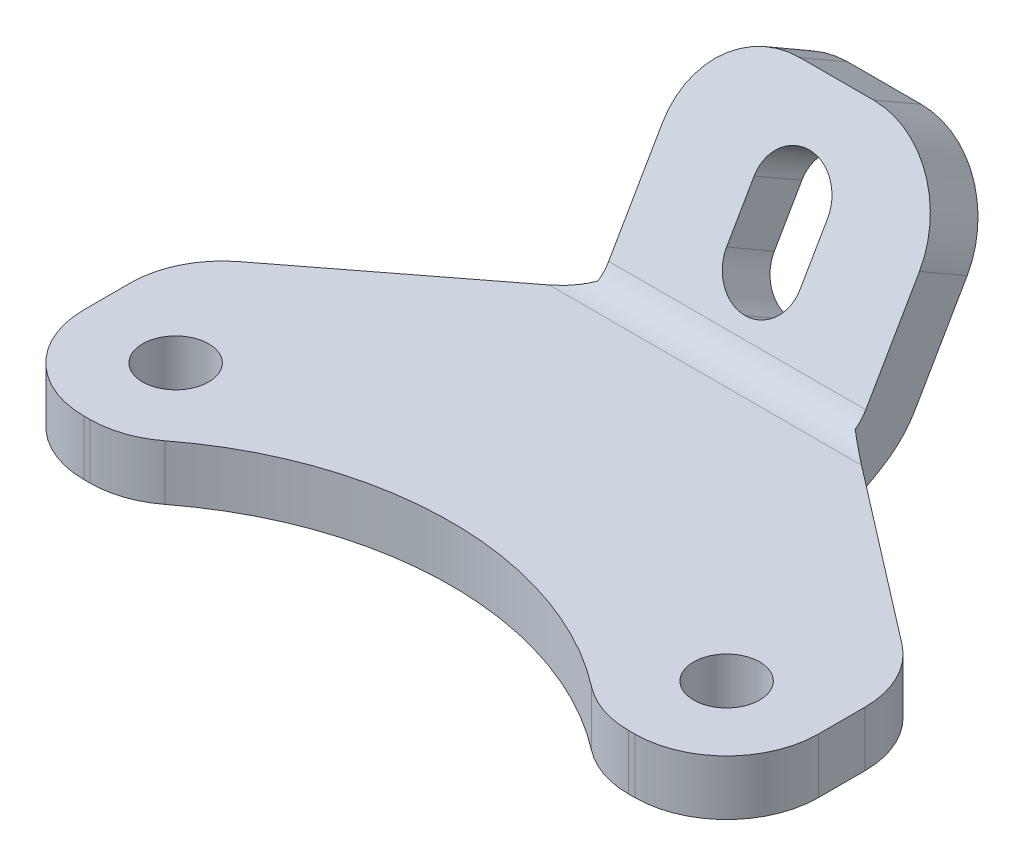
ISO-10303-21;
HEADER;
FILE_DESCRIPTION(('STEP AP214'),'2;1');
FILE_NAME('part.step','',(''),(''),'','','');
FILE_SCHEMA(('AUTOMOTIVE_DESIGN { 1 0 10303 214 1 1 1 1 }'));
ENDSEC;
DATA;
#1=APPLICATION_CONTEXT('core data for automotive mechanical design processes');
#2=APPLICATION_PROTOCOL_DEFINITION('international standard','automotive_design',2000,#1);
#3=PRODUCT_CONTEXT('',#1,'mechanical');
#4=PRODUCT('Part','Part','',(#3));
#5=PRODUCT_RELATED_PRODUCT_CATEGORY('part','',(#4));
#6=PRODUCT_DEFINITION_FORMATION('','',#4);
#7=PRODUCT_DEFINITION_CONTEXT('part definition',#1,'design');
#8=PRODUCT_DEFINITION('design','',#6,#7);
#9=PRODUCT_DEFINITION_SHAPE('','',#8);
#10=(LENGTH_UNIT() NAMED_UNIT(*) SI_UNIT(.MILLI.,.METRE.));
#11=(NAMED_UNIT(*) PLANE_ANGLE_UNIT() SI_UNIT($,.RADIAN.));
#12=(NAMED_UNIT(*) SI_UNIT($,.STERADIAN.) SOLID_ANGLE_UNIT());
#13=UNCERTAINTY_MEASURE_WITH_UNIT(LENGTH_MEASURE(1.E-05),#10,'distance_accuracy_value','');
#14=(GEOMETRIC_REPRESENTATION_CONTEXT(3) GLOBAL_UNCERTAINTY_ASSIGNED_CONTEXT((#13)) GLOBAL_UNIT_ASSIGNED_CONTEXT((#10,
#11,#12)) REPRESENTATION_CONTEXT('',''));
#15=CARTESIAN_POINT('',(0.,0.,0.));
#16=DIRECTION('',(0.,0.,1.));
#17=DIRECTION('',(1.,0.,0.));
#18=AXIS2_PLACEMENT_3D('',#15,#16,#17);
#19=CARTESIAN_POINT('',(0.,3.,0.));
#20=DIRECTION('',(0.,0.,-1.));
#21=DIRECTION('',(-1.,0.,0.));
#22=AXIS2_PLACEMENT_3D('',#19,#20,#21);
#23=PLANE('',#22);
#24=DIRECTION('',(1.,0.,0.));
#25=VECTOR('',#24,1.);
#26=CARTESIAN_POINT('',(0.,0.,0.));
#27=LINE('',#26,#25);
#28=CARTESIAN_POINT('',(5.,0.,0.));
#29=VERTEX_POINT('',#28);
#30=CARTESIAN_POINT('',(5.33712170138482,0.,0.));
#31=VERTEX_POINT('',#30);
#32=EDGE_CURVE('E488',#29,#31,#27,.T.);
#33=ORIENTED_EDGE('',*,*,#32,.T.);
#34=DIRECTION('',(0.,1.,0.));
#35=VECTOR('',#34,1.);
#36=CARTESIAN_POINT('',(5.33712170138482,3.,0.));
#37=LINE('',#36,#35);
#38=CARTESIAN_POINT('',(5.33712170138482,3.,0.));
#39=VERTEX_POINT('',#38);
#40=EDGE_CURVE('E431',#31,#39,#37,.T.);
#41=ORIENTED_EDGE('',*,*,#40,.T.);
#42=DIRECTION('',(1.,0.,0.));
#43=VECTOR('',#42,1.);
#44=CARTESIAN_POINT('',(0.,3.,0.));
#45=LINE('',#44,#43);
#46=CARTESIAN_POINT('',(5.,3.,0.));
#47=VERTEX_POINT('',#46);
#48=EDGE_CURVE('E478',#47,#39,#45,.T.);
#49=ORIENTED_EDGE('',*,*,#48,.F.);
#50=DIRECTION('',(0.,-1.,0.));
#51=VECTOR('',#50,1.);
#52=CARTESIAN_POINT('',(5.,3.,0.));
#53=LINE('',#52,#51);
#54=EDGE_CURVE('E389',#47,#29,#53,.T.);
#55=ORIENTED_EDGE('',*,*,#54,.T.);
#56=EDGE_LOOP('',(#33,#41,#49,#55));
#57=FACE_BOUND('',#56,.T.);
#58=ADVANCED_FACE('F39',(#57),#23,.F.);
#59=CARTESIAN_POINT('',(0.,3.,0.));
#60=DIRECTION('',(1.,0.,0.));
#61=DIRECTION('',(0.,0.,-1.));
#62=AXIS2_PLACEMENT_3D('',#59,#60,#61);
#63=PLANE('',#62);
#64=DIRECTION('',(0.,0.,1.));
#65=VECTOR('',#64,1.);
#66=CARTESIAN_POINT('',(0.,3.,0.));
#67=LINE('',#66,#65);
#68=CARTESIAN_POINT('',(0.,3.,-7.53799251274741));
#69=VERTEX_POINT('',#68);
#70=CARTESIAN_POINT('',(0.,3.,-5.));
#71=VERTEX_POINT('',#70);
#72=EDGE_CURVE('E495',#69,#71,#67,.T.);
#73=ORIENTED_EDGE('',*,*,#72,.F.);
#74=DIRECTION('',(0.,-1.,0.));
#75=VECTOR('',#74,1.);
#76=CARTESIAN_POINT('',(0.,3.,-7.53799251274741));
#77=LINE('',#76,#75);
#78=CARTESIAN_POINT('',(0.,0.,-7.53799251274741));
#79=VERTEX_POINT('',#78);
#80=EDGE_CURVE('E347',#69,#79,#77,.T.);
#81=ORIENTED_EDGE('',*,*,#80,.T.);
#82=DIRECTION('',(0.,0.,1.));
#83=VECTOR('',#82,1.);
#84=CARTESIAN_POINT('',(0.,0.,0.));
#85=LINE('',#84,#83);
#86=CARTESIAN_POINT('',(0.,0.,-5.));
#87=VERTEX_POINT('',#86);
#88=EDGE_CURVE('E482',#79,#87,#85,.T.);
#89=ORIENTED_EDGE('',*,*,#88,.T.);
#90=DIRECTION('',(0.,-1.,0.));
#91=VECTOR('',#90,1.);
#92=CARTESIAN_POINT('',(0.,3.,-5.));
#93=LINE('',#92,#91);
#94=EDGE_CURVE('E344',#87,#71,#93,.F.);
#95=ORIENTED_EDGE('',*,*,#94,.T.);
#96=EDGE_LOOP('',(#73,#81,#89,#95));
#97=FACE_BOUND('',#96,.T.);
#98=ADVANCED_FACE('F521',(#97),#63,.F.);
#99=CARTESIAN_POINT('',(34.6628782986152,3.,0.));
#100=VERTEX_POINT('',#99);
#101=CARTESIAN_POINT('',(35.,3.,0.));
#102=VERTEX_POINT('',#101);
#103=EDGE_CURVE('E500',#100,#102,#45,.T.);
#104=ORIENTED_EDGE('',*,*,#103,.F.);
#105=DIRECTION('',(0.,1.,0.));
#106=VECTOR('',#105,1.);
#107=CARTESIAN_POINT('',(34.6628782986152,3.,0.));
#108=LINE('',#107,#106);
#109=CARTESIAN_POINT('',(34.6628782986152,0.,0.));
#110=VERTEX_POINT('',#109);
#111=EDGE_CURVE('E409',#100,#110,#108,.F.);
#112=ORIENTED_EDGE('',*,*,#111,.T.);
#113=CARTESIAN_POINT('',(35.,0.,0.));
#114=VERTEX_POINT('',#113);
#115=EDGE_CURVE('E486',#110,#114,#27,.T.);
#116=ORIENTED_EDGE('',*,*,#115,.T.);
#117=DIRECTION('',(0.,-1.,0.));
#118=VECTOR('',#117,1.);
#119=CARTESIAN_POINT('',(35.,3.,0.));
#120=LINE('',#119,#118);
#121=EDGE_CURVE('E393',#114,#102,#120,.F.);
#122=ORIENTED_EDGE('',*,*,#121,.T.);
#123=EDGE_LOOP('',(#104,#112,#116,#122));
#124=FACE_BOUND('',#123,.T.);
#125=ADVANCED_FACE('F540',(#124),#23,.F.);
#126=CARTESIAN_POINT('',(40.,3.,0.));
#127=DIRECTION('',(-1.,0.,0.));
#128=DIRECTION('',(0.,0.,1.));
#129=AXIS2_PLACEMENT_3D('',#126,#127,#128);
#130=PLANE('',#129);
#131=DIRECTION('',(0.,0.,-1.));
#132=VECTOR('',#131,1.);
#133=CARTESIAN_POINT('',(40.,0.,0.));
#134=LINE('',#133,#132);
#135=CARTESIAN_POINT('',(40.,0.,-5.));
#136=VERTEX_POINT('',#135);
#137=CARTESIAN_POINT('',(40.,0.,-7.53799251274741));
#138=VERTEX_POINT('',#137);
#139=EDGE_CURVE('E247',#136,#138,#134,.T.);
#140=ORIENTED_EDGE('',*,*,#139,.T.);
#141=DIRECTION('',(0.,-1.,0.));
#142=VECTOR('',#141,1.);
#143=CARTESIAN_POINT('',(40.,3.,-7.53799251274741));
#144=LINE('',#143,#142);
#145=CARTESIAN_POINT('',(40.,3.,-7.53799251274741));
#146=VERTEX_POINT('',#145);
#147=EDGE_CURVE('E386',#138,#146,#144,.F.);
#148=ORIENTED_EDGE('',*,*,#147,.T.);
#149=DIRECTION('',(0.,0.,-1.));
#150=VECTOR('',#149,1.);
#151=CARTESIAN_POINT('',(40.,3.,0.));
#152=LINE('',#151,#150);
#153=CARTESIAN_POINT('',(40.,3.,-5.));
#154=VERTEX_POINT('',#153);
#155=EDGE_CURVE('E473',#154,#146,#152,.T.);
#156=ORIENTED_EDGE('',*,*,#155,.F.);
#157=DIRECTION('',(0.,-1.,0.));
#158=VECTOR('',#157,1.);
#159=CARTESIAN_POINT('',(40.,3.,-5.));
#160=LINE('',#159,#158);
#161=EDGE_CURVE('E382',#154,#136,#160,.T.);
#162=ORIENTED_EDGE('',*,*,#161,.T.);
#163=EDGE_LOOP('',(#140,#148,#156,#162));
#164=FACE_BOUND('',#163,.T.);
#165=ADVANCED_FACE('F535',(#164),#130,.F.);
#166=CARTESIAN_POINT('',(27.,3.,-20.));
#167=DIRECTION('',(-0.609710760849692,0.,0.7926239891046));
#168=DIRECTION('',(0.7926239891046,0.,0.609710760849692));
#169=AXIS2_PLACEMENT_3D('',#166,#167,#168);
#170=PLANE('',#169);
#171=DIRECTION('',(-0.7926239891046,0.,-0.609710760849692));
#172=VECTOR('',#171,1.);
#173=CARTESIAN_POINT('',(27.,3.,-20.));
#174=LINE('',#173,#172);
#175=CARTESIAN_POINT('',(38.0485538042485,3.,-11.5011124582704));
#176=VERTEX_POINT('',#175);
#177=CARTESIAN_POINT('',(28.501110699893,3.,-18.8452994616208));
#178=VERTEX_POINT('',#177);
#179=EDGE_CURVE('E466',#176,#178,#174,.T.);
#180=ORIENTED_EDGE('',*,*,#179,.F.);
#181=DIRECTION('',(0.,-1.,0.));
#182=VECTOR('',#181,1.);
#183=CARTESIAN_POINT('',(38.0485538042485,3.,-11.5011124582704));
#184=LINE('',#183,#182);
#185=CARTESIAN_POINT('',(38.0485538042485,0.,-11.5011124582704));
#186=VERTEX_POINT('',#185);
#187=EDGE_CURVE('E244',#176,#186,#184,.T.);
#188=ORIENTED_EDGE('',*,*,#187,.T.);
#189=DIRECTION('',(-0.7926239891046,0.,-0.609710760849692));
#190=VECTOR('',#189,1.);
#191=CARTESIAN_POINT('',(27.,0.,-20.));
#192=LINE('',#191,#190);
#193=CARTESIAN_POINT('',(27.,0.,-20.));
#194=VERTEX_POINT('',#193);
#195=EDGE_CURVE('E240',#186,#194,#192,.T.);
#196=ORIENTED_EDGE('',*,*,#195,.T.);
#197=DIRECTION('',(0.,-1.,0.));
#198=VECTOR('',#197,1.);
#199=CARTESIAN_POINT('',(27.,3.,-20.));
#200=LINE('',#199,#198);
#201=CARTESIAN_POINT('',(27.,3.36700683814455,-20.));
#202=VERTEX_POINT('',#201);
#203=EDGE_CURVE('E54',#202,#194,#200,.T.);
#204=ORIENTED_EDGE('',*,*,#203,.F.);
#205=CARTESIAN_POINT('',(28.501110699893,5.,-18.8452994616208));
#206=DIRECTION('',(-0.609710760849692,0.,0.7926239891046));
#207=DIRECTION('',(0.7926239891046,0.,0.609710760849692));
#208=AXIS2_PLACEMENT_3D('',#205,#206,#207);
#209=ELLIPSE('',#208,3.28024389337135,2.);
#210=EDGE_CURVE('E11',#202,#178,#209,.T.);
#211=ORIENTED_EDGE('',*,*,#210,.T.);
#212=EDGE_LOOP('',(#180,#188,#196,#204,#211));
#213=FACE_BOUND('',#212,.T.);
#214=ADVANCED_FACE('F242',(#213),#170,.F.);
#215=CARTESIAN_POINT('',(0.,3.,-10.));
#216=DIRECTION('',(0.609710760849692,0.,0.7926239891046));
#217=DIRECTION('',(0.7926239891046,0.,-0.609710760849692));
#218=AXIS2_PLACEMENT_3D('',#215,#216,#217);
#219=PLANE('',#218);
#220=DIRECTION('',(-0.7926239891046,0.,0.609710760849693));
#221=VECTOR('',#220,1.);
#222=CARTESIAN_POINT('',(0.,0.,-10.));
#223=LINE('',#222,#221);
#224=CARTESIAN_POINT('',(13.,0.,-20.));
#225=VERTEX_POINT('',#224);
#226=CARTESIAN_POINT('',(1.95144619575154,0.,-11.5011124582704));
#227=VERTEX_POINT('',#226);
#228=EDGE_CURVE('E254',#225,#227,#223,.T.);
#229=ORIENTED_EDGE('',*,*,#228,.T.);
#230=DIRECTION('',(0.,-1.,0.));
#231=VECTOR('',#230,1.);
#232=CARTESIAN_POINT('',(1.95144619575154,3.,-11.5011124582704));
#233=LINE('',#232,#231);
#234=CARTESIAN_POINT('',(1.95144619575154,3.,-11.5011124582704));
#235=VERTEX_POINT('',#234);
#236=EDGE_CURVE('E364',#227,#235,#233,.F.);
#237=ORIENTED_EDGE('',*,*,#236,.T.);
#238=DIRECTION('',(-0.7926239891046,0.,0.609710760849693));
#239=VECTOR('',#238,1.);
#240=CARTESIAN_POINT('',(0.,3.,-10.));
#241=LINE('',#240,#239);
#242=CARTESIAN_POINT('',(11.498889300107,3.,-18.8452994616208));
#243=VERTEX_POINT('',#242);
#244=EDGE_CURVE('E268',#243,#235,#241,.T.);
#245=ORIENTED_EDGE('',*,*,#244,.F.);
#246=CARTESIAN_POINT('',(11.498889300107,5.,-18.8452994616208));
#247=DIRECTION('',(0.609710760849692,0.,0.7926239891046));
#248=DIRECTION('',(0.7926239891046,0.,-0.609710760849692));
#249=AXIS2_PLACEMENT_3D('',#246,#247,#248);
#250=ELLIPSE('',#249,3.28024389337134,2.);
#251=CARTESIAN_POINT('',(13.,3.36700683814455,-20.));
#252=VERTEX_POINT('',#251);
#253=EDGE_CURVE('E442',#243,#252,#250,.T.);
#254=ORIENTED_EDGE('',*,*,#253,.T.);
#255=DIRECTION('',(0.,-1.,0.));
#256=VECTOR('',#255,1.);
#257=CARTESIAN_POINT('',(13.,3.,-20.));
#258=LINE('',#257,#256);
#259=EDGE_CURVE('E62',#252,#225,#258,.T.);
#260=ORIENTED_EDGE('',*,*,#259,.T.);
#261=EDGE_LOOP('',(#229,#237,#245,#254,#260));
#262=FACE_BOUND('',#261,.T.);
#263=ADVANCED_FACE('F526',(#262),#219,.F.);
#264=CARTESIAN_POINT('',(0.,3.,0.));
#265=DIRECTION('',(0.,-1.,0.));
#266=DIRECTION('',(0.,0.,-1.));
#267=AXIS2_PLACEMENT_3D('',#264,#265,#266);
#268=PLANE('',#267);
#269=CARTESIAN_POINT('',(5.,3.,-5.));
#270=DIRECTION('',(0.,1.,0.));
#271=DIRECTION('',(0.,0.,1.));
#272=AXIS2_PLACEMENT_3D('',#269,#270,#271);
#273=CIRCLE('',#272,1.8);
#274=CARTESIAN_POINT('',(5.,3.,-3.2));
#275=VERTEX_POINT('',#274);
#276=EDGE_CURVE('E608',#275,#275,#273,.T.);
#277=ORIENTED_EDGE('',*,*,#276,.F.);
#278=EDGE_LOOP('',(#277));
#279=FACE_BOUND('',#278,.T.);
#280=CARTESIAN_POINT('',(35.,3.,-5.));
#281=DIRECTION('',(0.,1.,0.));
#282=DIRECTION('',(0.,0.,1.));
#283=AXIS2_PLACEMENT_3D('',#280,#281,#282);
#284=CIRCLE('',#283,1.8);
#285=CARTESIAN_POINT('',(35.,3.,-3.2));
#286=VERTEX_POINT('',#285);
#287=EDGE_CURVE('E235',#286,#286,#284,.T.);
#288=ORIENTED_EDGE('',*,*,#287,.F.);
#289=EDGE_LOOP('',(#288));
#290=FACE_BOUND('',#289,.T.);
#291=ORIENTED_EDGE('',*,*,#179,.T.);
#292=DIRECTION('',(-1.,0.,0.));
#293=VECTOR('',#292,1.);
#294=CARTESIAN_POINT('',(13.,3.,-18.8452994616208));
#295=LINE('',#294,#293);
#296=EDGE_CURVE('E435',#178,#243,#295,.T.);
#297=ORIENTED_EDGE('',*,*,#296,.T.);
#298=ORIENTED_EDGE('',*,*,#244,.T.);
#299=CARTESIAN_POINT('',(5.,3.,-7.53799251274741));
#300=DIRECTION('',(0.,-1.,0.));
#301=DIRECTION('',(0.,0.,-1.));
#302=AXIS2_PLACEMENT_3D('',#299,#300,#301);
#303=CIRCLE('',#302,5.);
#304=EDGE_CURVE('E377',#235,#69,#303,.F.);
#305=ORIENTED_EDGE('',*,*,#304,.T.);
#306=ORIENTED_EDGE('',*,*,#72,.T.);
#307=CARTESIAN_POINT('',(5.,3.,-5.));
#308=DIRECTION('',(0.,-1.,0.));
#309=DIRECTION('',(0.,0.,-1.));
#310=AXIS2_PLACEMENT_3D('',#307,#308,#309);
#311=CIRCLE('',#310,5.);
#312=EDGE_CURVE('E368',#71,#47,#311,.F.);
#313=ORIENTED_EDGE('',*,*,#312,.T.);
#314=ORIENTED_EDGE('',*,*,#48,.T.);
#315=CARTESIAN_POINT('',(5.33712170138482,3.,-5.));
#316=DIRECTION('',(0.,-1.,0.));
#317=DIRECTION('',(0.,0.,-1.));
#318=AXIS2_PLACEMENT_3D('',#315,#316,#317);
#319=CIRCLE('',#318,5.);
#320=CARTESIAN_POINT('',(8.39188801359631,3.,-1.04166666666666));
#321=VERTEX_POINT('',#320);
#322=EDGE_CURVE('E425',#39,#321,#319,.F.);
#323=ORIENTED_EDGE('',*,*,#322,.T.);
#324=CARTESIAN_POINT('',(20.,3.,14.));
#325=DIRECTION('',(0.,1.,0.));
#326=DIRECTION('',(0.,0.,1.));
#327=AXIS2_PLACEMENT_3D('',#324,#325,#326);
#328=CIRCLE('',#327,19.);
#329=CARTESIAN_POINT('',(31.6081119864037,3.,-1.04166666666666));
#330=VERTEX_POINT('',#329);
#331=EDGE_CURVE('E567',#330,#321,#328,.T.);
#332=ORIENTED_EDGE('',*,*,#331,.F.);
#333=CARTESIAN_POINT('',(34.6628782986152,3.,-5.));
#334=DIRECTION('',(0.,-1.,0.));
#335=DIRECTION('',(0.,0.,-1.));
#336=AXIS2_PLACEMENT_3D('',#333,#334,#335);
#337=CIRCLE('',#336,5.);
#338=EDGE_CURVE('E428',#330,#100,#337,.F.);
#339=ORIENTED_EDGE('',*,*,#338,.T.);
#340=ORIENTED_EDGE('',*,*,#103,.T.);
#341=CARTESIAN_POINT('',(35.,3.,-5.));
#342=DIRECTION('',(0.,-1.,0.));
#343=DIRECTION('',(0.,0.,-1.));
#344=AXIS2_PLACEMENT_3D('',#341,#342,#343);
#345=CIRCLE('',#344,5.);
#346=EDGE_CURVE('E371',#102,#154,#345,.F.);
#347=ORIENTED_EDGE('',*,*,#346,.T.);
#348=ORIENTED_EDGE('',*,*,#155,.T.);
#349=CARTESIAN_POINT('',(35.,3.,-7.53799251274741));
#350=DIRECTION('',(0.,-1.,0.));
#351=DIRECTION('',(0.,0.,-1.));
#352=AXIS2_PLACEMENT_3D('',#349,#350,#351);
#353=CIRCLE('',#352,5.);
#354=EDGE_CURVE('E374',#146,#176,#353,.F.);
#355=ORIENTED_EDGE('',*,*,#354,.T.);
#356=EDGE_LOOP('',(#291,#297,#298,#305,#306,#313,#314,#323,#332,#339,#340,#347,#348,#355));
#357=FACE_BOUND('',#356,.T.);
#358=ADVANCED_FACE('F468',(#279,#290,#357),#268,.F.);
#359=CARTESIAN_POINT('',(0.,0.,0.));
#360=DIRECTION('',(0.,-1.,0.));
#361=DIRECTION('',(0.,0.,-1.));
#362=AXIS2_PLACEMENT_3D('',#359,#360,#361);
#363=PLANE('',#362);
#364=ORIENTED_EDGE('',*,*,#115,.F.);
#365=CARTESIAN_POINT('',(34.6628782986152,0.,-5.));
#366=DIRECTION('',(0.,-1.,0.));
#367=DIRECTION('',(0.,0.,-1.));
#368=AXIS2_PLACEMENT_3D('',#365,#366,#367);
#369=CIRCLE('',#368,5.);
#370=CARTESIAN_POINT('',(31.6081119864037,0.,-1.04166666666666));
#371=VERTEX_POINT('',#370);
#372=EDGE_CURVE('E416',#110,#371,#369,.T.);
#373=ORIENTED_EDGE('',*,*,#372,.T.);
#374=CARTESIAN_POINT('',(20.,0.,14.));
#375=DIRECTION('',(0.,1.,0.));
#376=DIRECTION('',(0.,0.,1.));
#377=AXIS2_PLACEMENT_3D('',#374,#375,#376);
#378=CIRCLE('',#377,19.);
#379=CARTESIAN_POINT('',(8.39188801359631,0.,-1.04166666666666));
#380=VERTEX_POINT('',#379);
#381=EDGE_CURVE('E316',#371,#380,#378,.T.);
#382=ORIENTED_EDGE('',*,*,#381,.T.);
#383=CARTESIAN_POINT('',(5.33712170138482,0.,-5.));
#384=DIRECTION('',(0.,-1.,0.));
#385=DIRECTION('',(0.,0.,-1.));
#386=AXIS2_PLACEMENT_3D('',#383,#384,#385);
#387=CIRCLE('',#386,5.);
#388=EDGE_CURVE('E413',#380,#31,#387,.T.);
#389=ORIENTED_EDGE('',*,*,#388,.T.);
#390=ORIENTED_EDGE('',*,*,#32,.F.);
#391=CARTESIAN_POINT('',(5.,0.,-5.));
#392=DIRECTION('',(0.,-1.,0.));
#393=DIRECTION('',(0.,0.,-1.));
#394=AXIS2_PLACEMENT_3D('',#391,#392,#393);
#395=CIRCLE('',#394,5.);
#396=EDGE_CURVE('E351',#29,#87,#395,.T.);
#397=ORIENTED_EDGE('',*,*,#396,.T.);
#398=ORIENTED_EDGE('',*,*,#88,.F.);
#399=CARTESIAN_POINT('',(5.,0.,-7.53799251274741));
#400=DIRECTION('',(0.,-1.,0.));
#401=DIRECTION('',(0.,0.,-1.));
#402=AXIS2_PLACEMENT_3D('',#399,#400,#401);
#403=CIRCLE('',#402,5.);
#404=EDGE_CURVE('E361',#79,#227,#403,.T.);
#405=ORIENTED_EDGE('',*,*,#404,.T.);
#406=ORIENTED_EDGE('',*,*,#228,.F.);
#407=DIRECTION('',(-1.,0.,0.));
#408=VECTOR('',#407,1.);
#409=CARTESIAN_POINT('',(13.,0.,-20.));
#410=LINE('',#409,#408);
#411=EDGE_CURVE('E229',#194,#225,#410,.T.);
#412=ORIENTED_EDGE('',*,*,#411,.F.);
#413=ORIENTED_EDGE('',*,*,#195,.F.);
#414=CARTESIAN_POINT('',(35.,0.,-7.53799251274741));
#415=DIRECTION('',(0.,-1.,0.));
#416=DIRECTION('',(0.,0.,-1.));
#417=AXIS2_PLACEMENT_3D('',#414,#415,#416);
#418=CIRCLE('',#417,5.);
#419=EDGE_CURVE('E358',#186,#138,#418,.T.);
#420=ORIENTED_EDGE('',*,*,#419,.T.);
#421=ORIENTED_EDGE('',*,*,#139,.F.);
#422=CARTESIAN_POINT('',(35.,0.,-5.));
#423=DIRECTION('',(0.,-1.,0.));
#424=DIRECTION('',(0.,0.,-1.));
#425=AXIS2_PLACEMENT_3D('',#422,#423,#424);
#426=CIRCLE('',#425,5.);
#427=EDGE_CURVE('E354',#136,#114,#426,.T.);
#428=ORIENTED_EDGE('',*,*,#427,.T.);
#429=EDGE_LOOP('',(#364,#373,#382,#389,#390,#397,#398,#405,#406,#412,#413,#420,#421,#428));
#430=FACE_BOUND('',#429,.T.);
#431=CARTESIAN_POINT('',(5.,0.,-5.));
#432=DIRECTION('',(0.,1.,0.));
#433=DIRECTION('',(0.,0.,1.));
#434=AXIS2_PLACEMENT_3D('',#431,#432,#433);
#435=CIRCLE('',#434,1.8);
#436=CARTESIAN_POINT('',(5.,0.,-3.2));
#437=VERTEX_POINT('',#436);
#438=EDGE_CURVE('E487',#437,#437,#435,.T.);
#439=ORIENTED_EDGE('',*,*,#438,.T.);
#440=EDGE_LOOP('',(#439));
#441=FACE_BOUND('',#440,.T.);
#442=CARTESIAN_POINT('',(35.,0.,-5.));
#443=DIRECTION('',(0.,1.,0.));
#444=DIRECTION('',(0.,0.,1.));
#445=AXIS2_PLACEMENT_3D('',#442,#443,#444);
#446=CIRCLE('',#445,1.8);
#447=CARTESIAN_POINT('',(35.,0.,-3.2));
#448=VERTEX_POINT('',#447);
#449=EDGE_CURVE('E611',#448,#448,#446,.T.);
#450=ORIENTED_EDGE('',*,*,#449,.T.);
#451=EDGE_LOOP('',(#450));
#452=FACE_BOUND('',#451,.T.);
#453=ADVANCED_FACE('F251',(#430,#441,#452),#363,.T.);
#454=CARTESIAN_POINT('',(35.,0.,-5.));
#455=DIRECTION('',(0.,1.,0.));
#456=DIRECTION('',(0.,0.,1.));
#457=AXIS2_PLACEMENT_3D('',#454,#455,#456);
#458=CYLINDRICAL_SURFACE('',#457,1.8);
#459=ORIENTED_EDGE('',*,*,#449,.F.);
#460=EDGE_LOOP('',(#459));
#461=FACE_BOUND('',#460,.T.);
#462=ORIENTED_EDGE('',*,*,#287,.T.);
#463=EDGE_LOOP('',(#462));
#464=FACE_BOUND('',#463,.T.);
#465=ADVANCED_FACE('F620',(#461,#464),#458,.F.);
#466=CARTESIAN_POINT('',(5.,0.,-5.));
#467=DIRECTION('',(0.,1.,0.));
#468=DIRECTION('',(0.,0.,1.));
#469=AXIS2_PLACEMENT_3D('',#466,#467,#468);
#470=CYLINDRICAL_SURFACE('',#469,1.8);
#471=ORIENTED_EDGE('',*,*,#438,.F.);
#472=EDGE_LOOP('',(#471));
#473=FACE_BOUND('',#472,.T.);
#474=ORIENTED_EDGE('',*,*,#276,.T.);
#475=EDGE_LOOP('',(#474));
#476=FACE_BOUND('',#475,.T.);
#477=ADVANCED_FACE('F623',(#473,#476),#470,.F.);
#478=CARTESIAN_POINT('',(27.,1.49999999999999,-22.5980762113533));
#479=DIRECTION('',(0.,-0.866025403784439,-0.499999999999999));
#480=DIRECTION('',(0.,0.499999999999999,-0.866025403784439));
#481=AXIS2_PLACEMENT_3D('',#478,#479,#480);
#482=PLANE('',#481);
#483=DIRECTION('',(0.,-0.499999999999999,0.866025403784439));
#484=VECTOR('',#483,1.);
#485=CARTESIAN_POINT('',(13.,1.49999999999999,-22.5980762113533));
#486=LINE('',#485,#484);
#487=CARTESIAN_POINT('',(13.,0.830127018922191,-21.4378221735089));
#488=VERTEX_POINT('',#487);
#489=EDGE_CURVE('E236',#488,#225,#486,.T.);
#490=ORIENTED_EDGE('',*,*,#489,.F.);
#491=DIRECTION('',(-1.,0.,0.));
#492=VECTOR('',#491,1.);
#493=CARTESIAN_POINT('',(27.,0.830127018922191,-21.4378221735089));
#494=LINE('',#493,#492);
#495=CARTESIAN_POINT('',(27.,0.830127018922191,-21.4378221735089));
#496=VERTEX_POINT('',#495);
#497=EDGE_CURVE('E231',#488,#496,#494,.F.);
#498=ORIENTED_EDGE('',*,*,#497,.T.);
#499=DIRECTION('',(0.,-0.499999999999999,0.866025403784439));
#500=VECTOR('',#499,1.);
#501=CARTESIAN_POINT('',(27.,1.49999999999999,-22.5980762113533));
#502=LINE('',#501,#500);
#503=EDGE_CURVE('E225',#496,#194,#502,.T.);
#504=ORIENTED_EDGE('',*,*,#503,.T.);
#505=ORIENTED_EDGE('',*,*,#411,.T.);
#506=EDGE_LOOP('',(#490,#498,#504,#505));
#507=FACE_BOUND('',#506,.T.);
#508=ADVANCED_FACE('F227',(#507),#482,.T.);
#509=CARTESIAN_POINT('',(27.,0.,0.));
#510=DIRECTION('',(-1.,0.,0.));
#511=DIRECTION('',(0.,0.,1.));
#512=AXIS2_PLACEMENT_3D('',#509,#510,#511);
#513=PLANE('',#512);
#514=ORIENTED_EDGE('',*,*,#503,.F.);
#515=CARTESIAN_POINT('',(27.,5.16025403784439,-18.9378221735089));
#516=DIRECTION('',(-1.,0.,0.));
#517=DIRECTION('',(0.,0.,1.));
#518=AXIS2_PLACEMENT_3D('',#515,#516,#517);
#519=CIRCLE('',#518,5.);
#520=CARTESIAN_POINT('',(27.,2.66025403784437,-23.2679491924311));
#521=VERTEX_POINT('',#520);
#522=EDGE_CURVE('E406',#496,#521,#519,.F.);
#523=ORIENTED_EDGE('',*,*,#522,.T.);
#524=DIRECTION('',(0.,-0.866025403784436,0.500000000000004));
#525=VECTOR('',#524,1.);
#526=CARTESIAN_POINT('',(27.,1.49999999999999,-22.5980762113533));
#527=LINE('',#526,#525);
#528=CARTESIAN_POINT('',(27.,7.56217782649104,-26.0980762113533));
#529=VERTEX_POINT('',#528);
#530=EDGE_CURVE('E594',#529,#521,#527,.T.);
#531=ORIENTED_EDGE('',*,*,#530,.F.);
#532=DIRECTION('',(0.,0.500000000000004,0.866025403784436));
#533=VECTOR('',#532,1.);
#534=CARTESIAN_POINT('',(27.,16.9724318643355,-9.79903810567677));
#535=LINE('',#534,#533);
#536=CARTESIAN_POINT('',(27.,9.06217782649105,-23.5));
#537=VERTEX_POINT('',#536);
#538=EDGE_CURVE('E340',#529,#537,#535,.T.);
#539=ORIENTED_EDGE('',*,*,#538,.T.);
#540=DIRECTION('',(0.,-0.866025403784436,0.500000000000004));
#541=VECTOR('',#540,1.);
#542=CARTESIAN_POINT('',(27.,3.,-20.));
#543=LINE('',#542,#541);
#544=CARTESIAN_POINT('',(27.,3.99999999999999,-20.5773502691896));
#545=VERTEX_POINT('',#544);
#546=EDGE_CURVE('E590',#537,#545,#543,.T.);
#547=ORIENTED_EDGE('',*,*,#546,.T.);
#548=CARTESIAN_POINT('',(27.,5.,-18.8452994616208));
#549=DIRECTION('',(-1.,0.,0.));
#550=DIRECTION('',(0.,0.,1.));
#551=AXIS2_PLACEMENT_3D('',#548,#549,#550);
#552=CIRCLE('',#551,2.);
#553=EDGE_CURVE('E48',#545,#202,#552,.T.);
#554=ORIENTED_EDGE('',*,*,#553,.T.);
#555=ORIENTED_EDGE('',*,*,#203,.T.);
#556=EDGE_LOOP('',(#514,#523,#531,#539,#547,#554,#555));
#557=FACE_BOUND('',#556,.T.);
#558=ADVANCED_FACE('F257',(#557),#513,.F.);
#559=CARTESIAN_POINT('',(13.,0.,0.));
#560=DIRECTION('',(-1.,0.,0.));
#561=DIRECTION('',(0.,0.,1.));
#562=AXIS2_PLACEMENT_3D('',#559,#560,#561);
#563=PLANE('',#562);
#564=DIRECTION('',(0.,0.866025403784436,-0.500000000000004));
#565=VECTOR('',#564,1.);
#566=CARTESIAN_POINT('',(13.,1.49999999999999,-22.5980762113533));
#567=LINE('',#566,#565);
#568=CARTESIAN_POINT('',(13.,2.66025403784437,-23.2679491924311));
#569=VERTEX_POINT('',#568);
#570=CARTESIAN_POINT('',(13.,7.56217782649104,-26.0980762113533));
#571=VERTEX_POINT('',#570);
#572=EDGE_CURVE('E586',#569,#571,#567,.T.);
#573=ORIENTED_EDGE('',*,*,#572,.F.);
#574=CARTESIAN_POINT('',(13.,5.16025403784439,-18.9378221735089));
#575=DIRECTION('',(-1.,0.,0.));
#576=DIRECTION('',(0.,0.,1.));
#577=AXIS2_PLACEMENT_3D('',#574,#575,#576);
#578=CIRCLE('',#577,5.);
#579=EDGE_CURVE('E401',#569,#488,#578,.T.);
#580=ORIENTED_EDGE('',*,*,#579,.T.);
#581=ORIENTED_EDGE('',*,*,#489,.T.);
#582=ORIENTED_EDGE('',*,*,#259,.F.);
#583=CARTESIAN_POINT('',(13.,5.,-18.8452994616208));
#584=DIRECTION('',(-1.,0.,0.));
#585=DIRECTION('',(0.,0.,1.));
#586=AXIS2_PLACEMENT_3D('',#583,#584,#585);
#587=CIRCLE('',#586,2.);
#588=CARTESIAN_POINT('',(13.,3.99999999999999,-20.5773502691896));
#589=VERTEX_POINT('',#588);
#590=EDGE_CURVE('E445',#252,#589,#587,.F.);
#591=ORIENTED_EDGE('',*,*,#590,.T.);
#592=DIRECTION('',(0.,0.866025403784436,-0.500000000000004));
#593=VECTOR('',#592,1.);
#594=CARTESIAN_POINT('',(13.,3.,-20.));
#595=LINE('',#594,#593);
#596=CARTESIAN_POINT('',(13.,9.06217782649106,-23.5));
#597=VERTEX_POINT('',#596);
#598=EDGE_CURVE('E452',#589,#597,#595,.T.);
#599=ORIENTED_EDGE('',*,*,#598,.T.);
#600=DIRECTION('',(0.,0.500000000000004,0.866025403784436));
#601=VECTOR('',#600,1.);
#602=CARTESIAN_POINT('',(13.,7.56217782649104,-26.0980762113533));
#603=LINE('',#602,#601);
#604=EDGE_CURVE('E330',#597,#571,#603,.F.);
#605=ORIENTED_EDGE('',*,*,#604,.T.);
#606=EDGE_LOOP('',(#573,#580,#581,#582,#591,#599,#605));
#607=FACE_BOUND('',#606,.T.);
#608=ADVANCED_FACE('F451',(#607),#563,.T.);
#609=CARTESIAN_POINT('',(13.,11.8923048454132,-28.5980762113534));
#610=DIRECTION('',(0.,-0.866025403784436,0.500000000000004));
#611=DIRECTION('',(0.,-0.500000000000004,-0.866025403784436));
#612=AXIS2_PLACEMENT_3D('',#609,#610,#611);
#613=PLANE('',#612);
#614=DIRECTION('',(1.,0.,0.));
#615=VECTOR('',#614,1.);
#616=CARTESIAN_POINT('',(13.,11.8923048454132,-28.5980762113534));
#617=LINE('',#616,#615);
#618=CARTESIAN_POINT('',(18.,11.8923048454132,-28.5980762113534));
#619=VERTEX_POINT('',#618);
#620=CARTESIAN_POINT('',(22.,11.8923048454132,-28.5980762113534));
#621=VERTEX_POINT('',#620);
#622=EDGE_CURVE('E589',#619,#621,#617,.T.);
#623=ORIENTED_EDGE('',*,*,#622,.F.);
#624=DIRECTION('',(0.,0.500000000000004,0.866025403784436));
#625=VECTOR('',#624,1.);
#626=CARTESIAN_POINT('',(18.,13.3923048454132,-26.));
#627=LINE('',#626,#625);
#628=CARTESIAN_POINT('',(18.,13.3923048454132,-26.));
#629=VERTEX_POINT('',#628);
#630=EDGE_CURVE('E319',#619,#629,#627,.T.);
#631=ORIENTED_EDGE('',*,*,#630,.T.);
#632=DIRECTION('',(1.,0.,0.));
#633=VECTOR('',#632,1.);
#634=CARTESIAN_POINT('',(13.,13.3923048454132,-26.));
#635=LINE('',#634,#633);
#636=CARTESIAN_POINT('',(22.,13.3923048454132,-26.));
#637=VERTEX_POINT('',#636);
#638=EDGE_CURVE('E461',#629,#637,#635,.T.);
#639=ORIENTED_EDGE('',*,*,#638,.T.);
#640=DIRECTION('',(0.,0.500000000000004,0.866025403784436));
#641=VECTOR('',#640,1.);
#642=CARTESIAN_POINT('',(22.,11.8923048454132,-28.5980762113534));
#643=LINE('',#642,#641);
#644=EDGE_CURVE('E306',#637,#621,#643,.F.);
#645=ORIENTED_EDGE('',*,*,#644,.T.);
#646=EDGE_LOOP('',(#623,#631,#639,#645));
#647=FACE_BOUND('',#646,.T.);
#648=ADVANCED_FACE('F637',(#647),#613,.F.);
#649=CARTESIAN_POINT('',(0.,-9.41025403784443,-16.2990381056766));
#650=DIRECTION('',(0.,-0.500000000000004,-0.866025403784436));
#651=DIRECTION('',(0.,0.866025403784436,-0.500000000000004));
#652=AXIS2_PLACEMENT_3D('',#649,#650,#651);
#653=PLANE('',#652);
#654=DIRECTION('',(0.,0.866025403784436,-0.500000000000004));
#655=VECTOR('',#654,1.);
#656=CARTESIAN_POINT('',(22.,9.29422863405991,-27.0980762113533));
#657=LINE('',#656,#655);
#658=CARTESIAN_POINT('',(22.,4.96410161513773,-24.5980762113533));
#659=VERTEX_POINT('',#658);
#660=CARTESIAN_POINT('',(22.,7.56217782649104,-26.0980762113533));
#661=VERTEX_POINT('',#660);
#662=EDGE_CURVE('E462',#659,#661,#657,.T.);
#663=ORIENTED_EDGE('',*,*,#662,.T.);
#664=CARTESIAN_POINT('',(20.,7.56217782649104,-26.0980762113533));
#665=DIRECTION('',(0.,-0.500000000000004,-0.866025403784436));
#666=DIRECTION('',(0.,0.866025403784436,-0.500000000000004));
#667=AXIS2_PLACEMENT_3D('',#664,#665,#666);
#668=CIRCLE('',#667,2.);
#669=CARTESIAN_POINT('',(20.,9.29422863405991,-27.0980762113533));
#670=VERTEX_POINT('',#669);
#671=EDGE_CURVE('E303',#661,#670,#668,.F.);
#672=ORIENTED_EDGE('',*,*,#671,.T.);
#673=CARTESIAN_POINT('',(20.,7.56217782649104,-26.0980762113533));
#674=DIRECTION('',(0.,-0.500000000000004,-0.866025403784436));
#675=DIRECTION('',(0.,0.866025403784436,-0.500000000000004));
#676=AXIS2_PLACEMENT_3D('',#673,#674,#675);
#677=CIRCLE('',#676,2.);
#678=CARTESIAN_POINT('',(18.,7.56217782649104,-26.0980762113533));
#679=VERTEX_POINT('',#678);
#680=EDGE_CURVE('E297',#670,#679,#677,.F.);
#681=ORIENTED_EDGE('',*,*,#680,.T.);
#682=DIRECTION('',(0.,-0.866025403784436,0.500000000000004));
#683=VECTOR('',#682,1.);
#684=CARTESIAN_POINT('',(18.,9.29422863405991,-27.0980762113533));
#685=LINE('',#684,#683);
#686=CARTESIAN_POINT('',(18.,4.96410161513773,-24.5980762113533));
#687=VERTEX_POINT('',#686);
#688=EDGE_CURVE('E572',#679,#687,#685,.T.);
#689=ORIENTED_EDGE('',*,*,#688,.T.);
#690=CARTESIAN_POINT('',(20.,4.96410161513773,-24.5980762113533));
#691=DIRECTION('',(0.,-0.500000000000004,-0.866025403784436));
#692=DIRECTION('',(0.,0.866025403784436,-0.500000000000004));
#693=AXIS2_PLACEMENT_3D('',#690,#691,#692);
#694=CIRCLE('',#693,2.);
#695=CARTESIAN_POINT('',(20.,3.23205080756886,-23.5980762113533));
#696=VERTEX_POINT('',#695);
#697=EDGE_CURVE('E291',#687,#696,#694,.F.);
#698=ORIENTED_EDGE('',*,*,#697,.T.);
#699=CARTESIAN_POINT('',(20.,4.96410161513773,-24.5980762113533));
#700=DIRECTION('',(0.,-0.500000000000004,-0.866025403784436));
#701=DIRECTION('',(0.,0.866025403784436,-0.500000000000004));
#702=AXIS2_PLACEMENT_3D('',#699,#700,#701);
#703=CIRCLE('',#702,2.);
#704=EDGE_CURVE('E285',#696,#659,#703,.F.);
#705=ORIENTED_EDGE('',*,*,#704,.T.);
#706=EDGE_LOOP('',(#663,#672,#681,#689,#698,#705));
#707=FACE_BOUND('',#706,.T.);
#708=ORIENTED_EDGE('',*,*,#530,.T.);
#709=DIRECTION('',(-1.,0.,0.));
#710=VECTOR('',#709,1.);
#711=CARTESIAN_POINT('',(0.,2.66025403784437,-23.2679491924311));
#712=LINE('',#711,#710);
#713=EDGE_CURVE('E397',#521,#569,#712,.T.);
#714=ORIENTED_EDGE('',*,*,#713,.T.);
#715=ORIENTED_EDGE('',*,*,#572,.T.);
#716=CARTESIAN_POINT('',(18.,7.56217782649104,-26.0980762113533));
#717=DIRECTION('',(0.,-0.500000000000004,-0.866025403784436));
#718=DIRECTION('',(0.,0.866025403784436,-0.500000000000004));
#719=AXIS2_PLACEMENT_3D('',#716,#717,#718);
#720=CIRCLE('',#719,5.);
#721=EDGE_CURVE('E337',#571,#619,#720,.T.);
#722=ORIENTED_EDGE('',*,*,#721,.T.);
#723=ORIENTED_EDGE('',*,*,#622,.T.);
#724=CARTESIAN_POINT('',(22.,7.56217782649104,-26.0980762113533));
#725=DIRECTION('',(0.,-0.500000000000004,-0.866025403784436));
#726=DIRECTION('',(0.,0.866025403784436,-0.500000000000004));
#727=AXIS2_PLACEMENT_3D('',#724,#725,#726);
#728=CIRCLE('',#727,5.);
#729=EDGE_CURVE('E334',#621,#529,#728,.T.);
#730=ORIENTED_EDGE('',*,*,#729,.T.);
#731=EDGE_LOOP('',(#708,#714,#715,#722,#723,#730));
#732=FACE_BOUND('',#731,.T.);
#733=ADVANCED_FACE('F642',(#707,#732),#653,.T.);
#734=CARTESIAN_POINT('',(0.,-7.91025403784442,-13.7009618943232));
#735=DIRECTION('',(0.,-0.500000000000004,-0.866025403784436));
#736=DIRECTION('',(0.,0.866025403784436,-0.500000000000004));
#737=AXIS2_PLACEMENT_3D('',#734,#735,#736);
#738=PLANE('',#737);
#739=CARTESIAN_POINT('',(20.,6.46410161513774,-22.));
#740=DIRECTION('',(0.,-0.500000000000004,-0.866025403784436));
#741=DIRECTION('',(0.,0.866025403784436,-0.500000000000004));
#742=AXIS2_PLACEMENT_3D('',#739,#740,#741);
#743=CIRCLE('',#742,2.);
#744=CARTESIAN_POINT('',(22.,6.46410161513774,-22.));
#745=VERTEX_POINT('',#744);
#746=CARTESIAN_POINT('',(20.,4.73205080756887,-21.));
#747=VERTEX_POINT('',#746);
#748=EDGE_CURVE('E282',#745,#747,#743,.T.);
#749=ORIENTED_EDGE('',*,*,#748,.T.);
#750=CARTESIAN_POINT('',(20.,6.46410161513774,-22.));
#751=DIRECTION('',(0.,-0.500000000000004,-0.866025403784436));
#752=DIRECTION('',(0.,0.866025403784436,-0.500000000000004));
#753=AXIS2_PLACEMENT_3D('',#750,#751,#752);
#754=CIRCLE('',#753,2.);
#755=CARTESIAN_POINT('',(18.,6.46410161513774,-22.));
#756=VERTEX_POINT('',#755);
#757=EDGE_CURVE('E288',#747,#756,#754,.T.);
#758=ORIENTED_EDGE('',*,*,#757,.T.);
#759=DIRECTION('',(0.,-0.866025403784436,0.500000000000004));
#760=VECTOR('',#759,1.);
#761=CARTESIAN_POINT('',(18.,10.7942286340599,-24.5));
#762=LINE('',#761,#760);
#763=CARTESIAN_POINT('',(18.,9.06217782649105,-23.5));
#764=VERTEX_POINT('',#763);
#765=EDGE_CURVE('E311',#764,#756,#762,.T.);
#766=ORIENTED_EDGE('',*,*,#765,.F.);
#767=CARTESIAN_POINT('',(20.,9.06217782649105,-23.5));
#768=DIRECTION('',(0.,-0.500000000000004,-0.866025403784436));
#769=DIRECTION('',(0.,0.866025403784436,-0.500000000000004));
#770=AXIS2_PLACEMENT_3D('',#767,#768,#769);
#771=CIRCLE('',#770,2.);
#772=CARTESIAN_POINT('',(20.,10.7942286340599,-24.5));
#773=VERTEX_POINT('',#772);
#774=EDGE_CURVE('E294',#764,#773,#771,.T.);
#775=ORIENTED_EDGE('',*,*,#774,.T.);
#776=CARTESIAN_POINT('',(20.,9.06217782649105,-23.5));
#777=DIRECTION('',(0.,-0.500000000000004,-0.866025403784436));
#778=DIRECTION('',(0.,0.866025403784436,-0.500000000000004));
#779=AXIS2_PLACEMENT_3D('',#776,#777,#778);
#780=CIRCLE('',#779,2.);
#781=CARTESIAN_POINT('',(22.,9.06217782649105,-23.5));
#782=VERTEX_POINT('',#781);
#783=EDGE_CURVE('E300',#773,#782,#780,.T.);
#784=ORIENTED_EDGE('',*,*,#783,.T.);
#785=DIRECTION('',(0.,0.866025403784436,-0.500000000000004));
#786=VECTOR('',#785,1.);
#787=CARTESIAN_POINT('',(22.,10.7942286340599,-24.5));
#788=LINE('',#787,#786);
#789=EDGE_CURVE('E576',#745,#782,#788,.T.);
#790=ORIENTED_EDGE('',*,*,#789,.F.);
#791=EDGE_LOOP('',(#749,#758,#766,#775,#784,#790));
#792=FACE_BOUND('',#791,.T.);
#793=ORIENTED_EDGE('',*,*,#598,.F.);
#794=DIRECTION('',(-1.,0.,0.));
#795=VECTOR('',#794,1.);
#796=CARTESIAN_POINT('',(27.,3.99999999999999,-20.5773502691896));
#797=LINE('',#796,#795);
#798=EDGE_CURVE('E439',#589,#545,#797,.F.);
#799=ORIENTED_EDGE('',*,*,#798,.T.);
#800=ORIENTED_EDGE('',*,*,#546,.F.);
#801=CARTESIAN_POINT('',(22.,9.06217782649105,-23.5));
#802=DIRECTION('',(0.,-0.500000000000004,-0.866025403784436));
#803=DIRECTION('',(0.,0.866025403784436,-0.500000000000004));
#804=AXIS2_PLACEMENT_3D('',#801,#802,#803);
#805=CIRCLE('',#804,5.);
#806=EDGE_CURVE('E323',#537,#637,#805,.F.);
#807=ORIENTED_EDGE('',*,*,#806,.T.);
#808=ORIENTED_EDGE('',*,*,#638,.F.);
#809=CARTESIAN_POINT('',(18.,9.06217782649105,-23.5));
#810=DIRECTION('',(0.,-0.500000000000004,-0.866025403784436));
#811=DIRECTION('',(0.,0.866025403784436,-0.500000000000004));
#812=AXIS2_PLACEMENT_3D('',#809,#810,#811);
#813=CIRCLE('',#812,5.);
#814=EDGE_CURVE('E326',#629,#597,#813,.F.);
#815=ORIENTED_EDGE('',*,*,#814,.T.);
#816=EDGE_LOOP('',(#793,#799,#800,#807,#808,#815));
#817=FACE_BOUND('',#816,.T.);
#818=ADVANCED_FACE('F456',(#792,#817),#738,.F.);
#819=CARTESIAN_POINT('',(18.,9.29422863405991,-27.0980762113533));
#820=DIRECTION('',(-1.,0.,0.));
#821=DIRECTION('',(0.,0.,1.));
#822=AXIS2_PLACEMENT_3D('',#819,#820,#821);
#823=PLANE('',#822);
#824=ORIENTED_EDGE('',*,*,#765,.T.);
#825=DIRECTION('',(0.,0.500000000000004,0.866025403784436));
#826=VECTOR('',#825,1.);
#827=CARTESIAN_POINT('',(18.,4.96410161513773,-24.5980762113533));
#828=LINE('',#827,#826);
#829=EDGE_CURVE('E279',#756,#687,#828,.F.);
#830=ORIENTED_EDGE('',*,*,#829,.T.);
#831=ORIENTED_EDGE('',*,*,#688,.F.);
#832=DIRECTION('',(0.,0.500000000000004,0.866025403784436));
#833=VECTOR('',#832,1.);
#834=CARTESIAN_POINT('',(18.,9.06217782649105,-23.5));
#835=LINE('',#834,#833);
#836=EDGE_CURVE('E275',#679,#764,#835,.T.);
#837=ORIENTED_EDGE('',*,*,#836,.T.);
#838=EDGE_LOOP('',(#824,#830,#831,#837));
#839=FACE_BOUND('',#838,.T.);
#840=ADVANCED_FACE('F646',(#839),#823,.F.);
#841=CARTESIAN_POINT('',(22.,9.29422863405991,-27.0980762113533));
#842=DIRECTION('',(1.,0.,0.));
#843=DIRECTION('',(0.,1.,0.));
#844=AXIS2_PLACEMENT_3D('',#841,#842,#843);
#845=PLANE('',#844);
#846=ORIENTED_EDGE('',*,*,#662,.F.);
#847=DIRECTION('',(0.,0.500000000000004,0.866025403784436));
#848=VECTOR('',#847,1.);
#849=CARTESIAN_POINT('',(22.,6.46410161513775,-22.));
#850=LINE('',#849,#848);
#851=EDGE_CURVE('E266',#659,#745,#850,.T.);
#852=ORIENTED_EDGE('',*,*,#851,.T.);
#853=ORIENTED_EDGE('',*,*,#789,.T.);
#854=DIRECTION('',(0.,0.500000000000004,0.866025403784436));
#855=VECTOR('',#854,1.);
#856=CARTESIAN_POINT('',(22.,7.56217782649104,-26.0980762113533));
#857=LINE('',#856,#855);
#858=EDGE_CURVE('E262',#782,#661,#857,.F.);
#859=ORIENTED_EDGE('',*,*,#858,.T.);
#860=EDGE_LOOP('',(#846,#852,#853,#859));
#861=FACE_BOUND('',#860,.T.);
#862=ADVANCED_FACE('F653',(#861),#845,.F.);
#863=CARTESIAN_POINT('',(20.,4.96410161513773,-24.5980762113533));
#864=DIRECTION('',(0.,-0.500000000000004,-0.866025403784436));
#865=DIRECTION('',(0.,0.866025403784436,-0.500000000000004));
#866=AXIS2_PLACEMENT_3D('',#863,#864,#865);
#867=CYLINDRICAL_SURFACE('',#866,2.);
#868=DIRECTION('',(0.,0.500000000000004,0.866025403784436));
#869=VECTOR('',#868,1.);
#870=CARTESIAN_POINT('',(20.,4.73205080756887,-21.));
#871=LINE('',#870,#869);
#872=EDGE_CURVE('E307',#696,#747,#871,.T.);
#873=ORIENTED_EDGE('',*,*,#872,.F.);
#874=ORIENTED_EDGE('',*,*,#697,.F.);
#875=ORIENTED_EDGE('',*,*,#829,.F.);
#876=ORIENTED_EDGE('',*,*,#757,.F.);
#877=EDGE_LOOP('',(#873,#874,#875,#876));
#878=FACE_BOUND('',#877,.T.);
#879=ADVANCED_FACE('F657',(#878),#867,.F.);
#880=CARTESIAN_POINT('',(20.,4.96410161513773,-24.5980762113533));
#881=DIRECTION('',(0.,-0.500000000000004,-0.866025403784436));
#882=DIRECTION('',(0.,0.866025403784436,-0.500000000000004));
#883=AXIS2_PLACEMENT_3D('',#880,#881,#882);
#884=CYLINDRICAL_SURFACE('',#883,2.);
#885=ORIENTED_EDGE('',*,*,#704,.F.);
#886=ORIENTED_EDGE('',*,*,#872,.T.);
#887=ORIENTED_EDGE('',*,*,#748,.F.);
#888=ORIENTED_EDGE('',*,*,#851,.F.);
#889=EDGE_LOOP('',(#885,#886,#887,#888));
#890=FACE_BOUND('',#889,.T.);
#891=ADVANCED_FACE('F855',(#890),#884,.F.);
#892=CARTESIAN_POINT('',(20.,7.56217782649104,-26.0980762113533));
#893=DIRECTION('',(0.,-0.500000000000004,-0.866025403784436));
#894=DIRECTION('',(0.,0.866025403784436,-0.500000000000004));
#895=AXIS2_PLACEMENT_3D('',#892,#893,#894);
#896=CYLINDRICAL_SURFACE('',#895,2.);
#897=DIRECTION('',(0.,0.500000000000004,0.866025403784436));
#898=VECTOR('',#897,1.);
#899=CARTESIAN_POINT('',(20.,10.7942286340599,-24.5));
#900=LINE('',#899,#898);
#901=EDGE_CURVE('E312',#670,#773,#900,.T.);
#902=ORIENTED_EDGE('',*,*,#901,.F.);
#903=ORIENTED_EDGE('',*,*,#671,.F.);
#904=ORIENTED_EDGE('',*,*,#858,.F.);
#905=ORIENTED_EDGE('',*,*,#783,.F.);
#906=EDGE_LOOP('',(#902,#903,#904,#905));
#907=FACE_BOUND('',#906,.T.);
#908=ADVANCED_FACE('F845',(#907),#896,.F.);
#909=CARTESIAN_POINT('',(20.,7.56217782649104,-26.0980762113533));
#910=DIRECTION('',(0.,-0.500000000000004,-0.866025403784436));
#911=DIRECTION('',(0.,0.866025403784436,-0.500000000000004));
#912=AXIS2_PLACEMENT_3D('',#909,#910,#911);
#913=CYLINDRICAL_SURFACE('',#912,2.);
#914=ORIENTED_EDGE('',*,*,#680,.F.);
#915=ORIENTED_EDGE('',*,*,#901,.T.);
#916=ORIENTED_EDGE('',*,*,#774,.F.);
#917=ORIENTED_EDGE('',*,*,#836,.F.);
#918=EDGE_LOOP('',(#914,#915,#916,#917));
#919=FACE_BOUND('',#918,.T.);
#920=ADVANCED_FACE('F829',(#919),#913,.F.);
#921=CARTESIAN_POINT('',(18.,7.56217782649104,-26.0980762113533));
#922=DIRECTION('',(0.,-0.500000000000004,-0.866025403784436));
#923=DIRECTION('',(0.,0.866025403784436,-0.500000000000004));
#924=AXIS2_PLACEMENT_3D('',#921,#922,#923);
#925=CYLINDRICAL_SURFACE('',#924,5.);
#926=ORIENTED_EDGE('',*,*,#721,.F.);
#927=ORIENTED_EDGE('',*,*,#604,.F.);
#928=ORIENTED_EDGE('',*,*,#814,.F.);
#929=ORIENTED_EDGE('',*,*,#630,.F.);
#930=EDGE_LOOP('',(#926,#927,#928,#929));
#931=FACE_BOUND('',#930,.T.);
#932=ADVANCED_FACE('F819',(#931),#925,.T.);
#933=CARTESIAN_POINT('',(22.,16.9724318643355,-9.79903810567677));
#934=DIRECTION('',(0.,0.500000000000004,0.866025403784436));
#935=DIRECTION('',(0.,-0.866025403784436,0.500000000000004));
#936=AXIS2_PLACEMENT_3D('',#933,#934,#935);
#937=CYLINDRICAL_SURFACE('',#936,5.);
#938=ORIENTED_EDGE('',*,*,#729,.F.);
#939=ORIENTED_EDGE('',*,*,#644,.F.);
#940=ORIENTED_EDGE('',*,*,#806,.F.);
#941=ORIENTED_EDGE('',*,*,#538,.F.);
#942=EDGE_LOOP('',(#938,#939,#940,#941));
#943=FACE_BOUND('',#942,.T.);
#944=ADVANCED_FACE('F800',(#943),#937,.T.);
#945=CARTESIAN_POINT('',(5.,3.,-7.53799251274741));
#946=DIRECTION('',(0.,-1.,0.));
#947=DIRECTION('',(0.,0.,-1.));
#948=AXIS2_PLACEMENT_3D('',#945,#946,#947);
#949=CYLINDRICAL_SURFACE('',#948,5.);
#950=ORIENTED_EDGE('',*,*,#304,.F.);
#951=ORIENTED_EDGE('',*,*,#236,.F.);
#952=ORIENTED_EDGE('',*,*,#404,.F.);
#953=ORIENTED_EDGE('',*,*,#80,.F.);
#954=EDGE_LOOP('',(#950,#951,#952,#953));
#955=FACE_BOUND('',#954,.T.);
#956=ADVANCED_FACE('F525',(#955),#949,.T.);
#957=CARTESIAN_POINT('',(35.,3.,-7.53799251274741));
#958=DIRECTION('',(0.,-1.,0.));
#959=DIRECTION('',(0.,0.,-1.));
#960=AXIS2_PLACEMENT_3D('',#957,#958,#959);
#961=CYLINDRICAL_SURFACE('',#960,5.);
#962=ORIENTED_EDGE('',*,*,#354,.F.);
#963=ORIENTED_EDGE('',*,*,#147,.F.);
#964=ORIENTED_EDGE('',*,*,#419,.F.);
#965=ORIENTED_EDGE('',*,*,#187,.F.);
#966=EDGE_LOOP('',(#962,#963,#964,#965));
#967=FACE_BOUND('',#966,.T.);
#968=ADVANCED_FACE('F782',(#967),#961,.T.);
#969=CARTESIAN_POINT('',(35.,3.,-5.));
#970=DIRECTION('',(0.,-1.,0.));
#971=DIRECTION('',(0.,0.,-1.));
#972=AXIS2_PLACEMENT_3D('',#969,#970,#971);
#973=CYLINDRICAL_SURFACE('',#972,5.);
#974=ORIENTED_EDGE('',*,*,#346,.F.);
#975=ORIENTED_EDGE('',*,*,#121,.F.);
#976=ORIENTED_EDGE('',*,*,#427,.F.);
#977=ORIENTED_EDGE('',*,*,#161,.F.);
#978=EDGE_LOOP('',(#974,#975,#976,#977));
#979=FACE_BOUND('',#978,.T.);
#980=ADVANCED_FACE('F672',(#979),#973,.T.);
#981=CARTESIAN_POINT('',(5.,3.,-5.));
#982=DIRECTION('',(0.,-1.,0.));
#983=DIRECTION('',(0.,0.,-1.));
#984=AXIS2_PLACEMENT_3D('',#981,#982,#983);
#985=CYLINDRICAL_SURFACE('',#984,5.);
#986=ORIENTED_EDGE('',*,*,#312,.F.);
#987=ORIENTED_EDGE('',*,*,#94,.F.);
#988=ORIENTED_EDGE('',*,*,#396,.F.);
#989=ORIENTED_EDGE('',*,*,#54,.F.);
#990=EDGE_LOOP('',(#986,#987,#988,#989));
#991=FACE_BOUND('',#990,.T.);
#992=ADVANCED_FACE('F517',(#991),#985,.T.);
#993=CARTESIAN_POINT('',(0.,5.16025403784439,-18.9378221735089));
#994=DIRECTION('',(-1.,0.,0.));
#995=DIRECTION('',(0.,0.,1.));
#996=AXIS2_PLACEMENT_3D('',#993,#994,#995);
#997=CYLINDRICAL_SURFACE('',#996,5.);
#998=ORIENTED_EDGE('',*,*,#522,.F.);
#999=ORIENTED_EDGE('',*,*,#497,.F.);
#1000=ORIENTED_EDGE('',*,*,#579,.F.);
#1001=ORIENTED_EDGE('',*,*,#713,.F.);
#1002=EDGE_LOOP('',(#998,#999,#1000,#1001));
#1003=FACE_BOUND('',#1002,.T.);
#1004=ADVANCED_FACE('F660',(#1003),#997,.T.);
#1005=CARTESIAN_POINT('',(20.,0.,14.));
#1006=DIRECTION('',(0.,1.,0.));
#1007=DIRECTION('',(0.,0.,1.));
#1008=AXIS2_PLACEMENT_3D('',#1005,#1006,#1007);
#1009=CYLINDRICAL_SURFACE('',#1008,19.);
#1010=ORIENTED_EDGE('',*,*,#381,.F.);
#1011=DIRECTION('',(0.,1.,0.));
#1012=VECTOR('',#1011,1.);
#1013=CARTESIAN_POINT('',(31.6081119864037,0.,-1.04166666666667));
#1014=LINE('',#1013,#1012);
#1015=EDGE_CURVE('E422',#371,#330,#1014,.T.);
#1016=ORIENTED_EDGE('',*,*,#1015,.T.);
#1017=ORIENTED_EDGE('',*,*,#331,.T.);
#1018=DIRECTION('',(0.,1.,0.));
#1019=VECTOR('',#1018,1.);
#1020=CARTESIAN_POINT('',(8.39188801359631,0.,-1.04166666666666));
#1021=LINE('',#1020,#1019);
#1022=EDGE_CURVE('E419',#321,#380,#1021,.F.);
#1023=ORIENTED_EDGE('',*,*,#1022,.T.);
#1024=EDGE_LOOP('',(#1010,#1016,#1017,#1023));
#1025=FACE_BOUND('',#1024,.T.);
#1026=ADVANCED_FACE('F564',(#1025),#1009,.F.);
#1027=CARTESIAN_POINT('',(34.6628782986152,0.,-5.));
#1028=DIRECTION('',(0.,1.,0.));
#1029=DIRECTION('',(0.,0.,1.));
#1030=AXIS2_PLACEMENT_3D('',#1027,#1028,#1029);
#1031=CYLINDRICAL_SURFACE('',#1030,5.);
#1032=ORIENTED_EDGE('',*,*,#338,.F.);
#1033=ORIENTED_EDGE('',*,*,#1015,.F.);
#1034=ORIENTED_EDGE('',*,*,#372,.F.);
#1035=ORIENTED_EDGE('',*,*,#111,.F.);
#1036=EDGE_LOOP('',(#1032,#1033,#1034,#1035));
#1037=FACE_BOUND('',#1036,.T.);
#1038=ADVANCED_FACE('F558',(#1037),#1031,.T.);
#1039=CARTESIAN_POINT('',(5.33712170138482,0.,-5.));
#1040=DIRECTION('',(0.,1.,0.));
#1041=DIRECTION('',(0.,0.,1.));
#1042=AXIS2_PLACEMENT_3D('',#1039,#1040,#1041);
#1043=CYLINDRICAL_SURFACE('',#1042,5.);
#1044=ORIENTED_EDGE('',*,*,#388,.F.);
#1045=ORIENTED_EDGE('',*,*,#1022,.F.);
#1046=ORIENTED_EDGE('',*,*,#322,.F.);
#1047=ORIENTED_EDGE('',*,*,#40,.F.);
#1048=EDGE_LOOP('',(#1044,#1045,#1046,#1047));
#1049=FACE_BOUND('',#1048,.T.);
#1050=ADVANCED_FACE('F665',(#1049),#1043,.T.);
#1051=CARTESIAN_POINT('',(0.,5.,-18.8452994616208));
#1052=DIRECTION('',(1.,0.,0.));
#1053=DIRECTION('',(0.,0.,-1.));
#1054=AXIS2_PLACEMENT_3D('',#1051,#1052,#1053);
#1055=CYLINDRICAL_SURFACE('',#1054,2.);
#1056=ORIENTED_EDGE('',*,*,#553,.F.);
#1057=ORIENTED_EDGE('',*,*,#798,.F.);
#1058=ORIENTED_EDGE('',*,*,#590,.F.);
#1059=ORIENTED_EDGE('',*,*,#253,.F.);
#1060=ORIENTED_EDGE('',*,*,#296,.F.);
#1061=ORIENTED_EDGE('',*,*,#210,.F.);
#1062=EDGE_LOOP('',(#1056,#1057,#1058,#1059,#1060,#1061));
#1063=FACE_BOUND('',#1062,.T.);
#1064=ADVANCED_FACE('F41',(#1063),#1055,.F.);
#1065=CLOSED_SHELL('',(#58,#98,#125,#165,#214,#263,#358,#453,#465,#477,#508,#558,#608,#648,#733,
#818,#840,#862,#879,#891,#908,#920,#932,#944,#956,#968,#980,#992,#1004,#1026,#1038,#1050,#1064));
#1066=MANIFOLD_SOLID_BREP('B2',#1065);
#1067=ADVANCED_BREP_SHAPE_REPRESENTATION('',(#18,#1066),#14);
#1068=SHAPE_DEFINITION_REPRESENTATION(#9,#1067);
ENDSEC;
END-ISO-10303-21;
